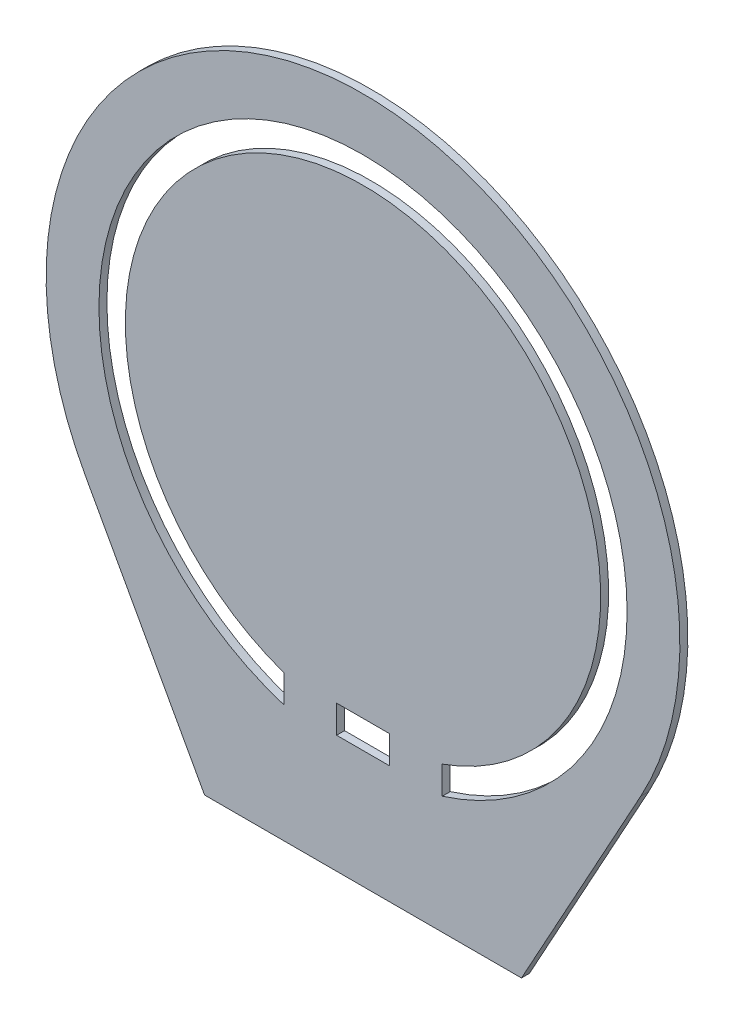
ISO-10303-21;
HEADER;
FILE_DESCRIPTION(('STEP AP214'),'2;1');
FILE_NAME('part.step','',(''),(''),'','','');
FILE_SCHEMA(('AUTOMOTIVE_DESIGN { 1 0 10303 214 1 1 1 1 }'));
ENDSEC;
DATA;
#1=APPLICATION_CONTEXT('core data for automotive mechanical design processes');
#2=APPLICATION_PROTOCOL_DEFINITION('international standard','automotive_design',2000,#1);
#3=PRODUCT_CONTEXT('',#1,'mechanical');
#4=PRODUCT('Part','Part','',(#3));
#5=PRODUCT_RELATED_PRODUCT_CATEGORY('part','',(#4));
#6=PRODUCT_DEFINITION_FORMATION('','',#4);
#7=PRODUCT_DEFINITION_CONTEXT('part definition',#1,'design');
#8=PRODUCT_DEFINITION('design','',#6,#7);
#9=PRODUCT_DEFINITION_SHAPE('','',#8);
#10=(LENGTH_UNIT() NAMED_UNIT(*) SI_UNIT(.MILLI.,.METRE.));
#11=(NAMED_UNIT(*) PLANE_ANGLE_UNIT() SI_UNIT($,.RADIAN.));
#12=(NAMED_UNIT(*) SI_UNIT($,.STERADIAN.) SOLID_ANGLE_UNIT());
#13=UNCERTAINTY_MEASURE_WITH_UNIT(LENGTH_MEASURE(1.E-05),#10,'distance_accuracy_value','');
#14=(GEOMETRIC_REPRESENTATION_CONTEXT(3) GLOBAL_UNCERTAINTY_ASSIGNED_CONTEXT((#13)) GLOBAL_UNIT_ASSIGNED_CONTEXT((#10,
#11,#12)) REPRESENTATION_CONTEXT('',''));
#15=CARTESIAN_POINT('',(0.,0.,0.));
#16=DIRECTION('',(0.,0.,1.));
#17=DIRECTION('',(1.,0.,0.));
#18=AXIS2_PLACEMENT_3D('',#15,#16,#17);
#19=CARTESIAN_POINT('',(26.2928846476365,-14.4459065795843,0.75438));
#20=DIRECTION('',(-0.876429488254552,0.481530219319478,0.));
#21=DIRECTION('',(-0.481530219319478,-0.876429488254552,0.));
#22=AXIS2_PLACEMENT_3D('',#19,#20,#21);
#23=PLANE('',#22);
#24=DIRECTION('',(0.481530219319478,0.876429488254552,0.));
#25=VECTOR('',#24,1.);
#26=CARTESIAN_POINT('',(26.2928846476365,-14.4459065795843,0.));
#27=LINE('',#26,#25);
#28=CARTESIAN_POINT('',(15.,-35.,0.));
#29=VERTEX_POINT('',#28);
#30=CARTESIAN_POINT('',(26.2928846476365,-14.4459065795843,0.));
#31=VERTEX_POINT('',#30);
#32=EDGE_CURVE('E179',#29,#31,#27,.T.);
#33=ORIENTED_EDGE('',*,*,#32,.T.);
#34=DIRECTION('',(0.,0.,-1.));
#35=VECTOR('',#34,1.);
#36=CARTESIAN_POINT('',(26.2928846476365,-14.4459065795843,0.75438));
#37=LINE('',#36,#35);
#38=CARTESIAN_POINT('',(26.2928846476365,-14.4459065795843,0.75438));
#39=VERTEX_POINT('',#38);
#40=EDGE_CURVE('E11',#39,#31,#37,.T.);
#41=ORIENTED_EDGE('',*,*,#40,.F.);
#42=DIRECTION('',(0.481530219319478,0.876429488254552,0.));
#43=VECTOR('',#42,1.);
#44=CARTESIAN_POINT('',(26.2928846476365,-14.4459065795843,0.75438));
#45=LINE('',#44,#43);
#46=CARTESIAN_POINT('',(15.,-35.,0.75438));
#47=VERTEX_POINT('',#46);
#48=EDGE_CURVE('E139',#47,#39,#45,.T.);
#49=ORIENTED_EDGE('',*,*,#48,.F.);
#50=DIRECTION('',(0.,0.,-1.));
#51=VECTOR('',#50,1.);
#52=CARTESIAN_POINT('',(15.,-35.,0.75438));
#53=LINE('',#52,#51);
#54=EDGE_CURVE('E187',#47,#29,#53,.T.);
#55=ORIENTED_EDGE('',*,*,#54,.T.);
#56=EDGE_LOOP('',(#33,#41,#49,#55));
#57=FACE_BOUND('',#56,.T.);
#58=ADVANCED_FACE('F38',(#57),#23,.F.);
#59=CARTESIAN_POINT('',(0.,0.,0.75438));
#60=DIRECTION('',(0.,0.,-1.));
#61=DIRECTION('',(-1.,0.,0.));
#62=AXIS2_PLACEMENT_3D('',#59,#60,#61);
#63=CYLINDRICAL_SURFACE('',#62,30.);
#64=CARTESIAN_POINT('',(0.,0.,0.));
#65=DIRECTION('',(0.,0.,1.));
#66=DIRECTION('',(1.,0.,0.));
#67=AXIS2_PLACEMENT_3D('',#64,#65,#66);
#68=CIRCLE('',#67,30.);
#69=CARTESIAN_POINT('',(-26.2928846476366,-14.4459065795843,0.));
#70=VERTEX_POINT('',#69);
#71=EDGE_CURVE('E145',#31,#70,#68,.T.);
#72=ORIENTED_EDGE('',*,*,#71,.T.);
#73=DIRECTION('',(0.,0.,-1.));
#74=VECTOR('',#73,1.);
#75=CARTESIAN_POINT('',(-26.2928846476366,-14.4459065795843,0.75438));
#76=LINE('',#75,#74);
#77=CARTESIAN_POINT('',(-26.2928846476366,-14.4459065795843,0.75438));
#78=VERTEX_POINT('',#77);
#79=EDGE_CURVE('E48',#78,#70,#76,.T.);
#80=ORIENTED_EDGE('',*,*,#79,.F.);
#81=CARTESIAN_POINT('',(0.,0.,0.75438));
#82=DIRECTION('',(0.,0.,1.));
#83=DIRECTION('',(1.,0.,0.));
#84=AXIS2_PLACEMENT_3D('',#81,#82,#83);
#85=CIRCLE('',#84,30.);
#86=EDGE_CURVE('E133',#39,#78,#85,.T.);
#87=ORIENTED_EDGE('',*,*,#86,.F.);
#88=ORIENTED_EDGE('',*,*,#40,.T.);
#89=EDGE_LOOP('',(#72,#80,#87,#88));
#90=FACE_BOUND('',#89,.T.);
#91=ADVANCED_FACE('F144',(#90),#63,.T.);
#92=CARTESIAN_POINT('',(-26.2928846476366,-14.4459065795843,0.75438));
#93=DIRECTION('',(-0.876429488254552,-0.481530219319478,0.));
#94=DIRECTION('',(0.481530219319478,-0.876429488254552,0.));
#95=AXIS2_PLACEMENT_3D('',#92,#93,#94);
#96=PLANE('',#95);
#97=DIRECTION('',(-0.481530219319478,0.876429488254552,0.));
#98=VECTOR('',#97,1.);
#99=CARTESIAN_POINT('',(-26.2928846476366,-14.4459065795843,0.));
#100=LINE('',#99,#98);
#101=CARTESIAN_POINT('',(-15.,-35.,0.));
#102=VERTEX_POINT('',#101);
#103=EDGE_CURVE('E183',#102,#70,#100,.T.);
#104=ORIENTED_EDGE('',*,*,#103,.F.);
#105=DIRECTION('',(0.,0.,-1.));
#106=VECTOR('',#105,1.);
#107=CARTESIAN_POINT('',(-15.,-35.,0.75438));
#108=LINE('',#107,#106);
#109=CARTESIAN_POINT('',(-15.,-35.,0.75438));
#110=VERTEX_POINT('',#109);
#111=EDGE_CURVE('E97',#110,#102,#108,.T.);
#112=ORIENTED_EDGE('',*,*,#111,.F.);
#113=DIRECTION('',(-0.481530219319478,0.876429488254552,0.));
#114=VECTOR('',#113,1.);
#115=CARTESIAN_POINT('',(-26.2928846476366,-14.4459065795843,0.75438));
#116=LINE('',#115,#114);
#117=EDGE_CURVE('E137',#110,#78,#116,.T.);
#118=ORIENTED_EDGE('',*,*,#117,.T.);
#119=ORIENTED_EDGE('',*,*,#79,.T.);
#120=EDGE_LOOP('',(#104,#112,#118,#119));
#121=FACE_BOUND('',#120,.T.);
#122=ADVANCED_FACE('F150',(#121),#96,.T.);
#123=CARTESIAN_POINT('',(2.5,0.,0.75438));
#124=DIRECTION('',(-1.,0.,0.));
#125=DIRECTION('',(0.,0.,1.));
#126=AXIS2_PLACEMENT_3D('',#123,#124,#125);
#127=PLANE('',#126);
#128=DIRECTION('',(0.,1.,0.));
#129=VECTOR('',#128,1.);
#130=CARTESIAN_POINT('',(2.5,0.,0.));
#131=LINE('',#130,#129);
#132=CARTESIAN_POINT('',(2.5,-23.8484800354236,0.));
#133=VERTEX_POINT('',#132);
#134=CARTESIAN_POINT('',(2.5,-21.2132034355964,0.));
#135=VERTEX_POINT('',#134);
#136=EDGE_CURVE('E167',#133,#135,#131,.T.);
#137=ORIENTED_EDGE('',*,*,#136,.F.);
#138=DIRECTION('',(0.,0.,-1.));
#139=VECTOR('',#138,1.);
#140=CARTESIAN_POINT('',(2.5,-23.8484800354236,0.75438));
#141=LINE('',#140,#139);
#142=CARTESIAN_POINT('',(2.5,-23.8484800354236,0.75438));
#143=VERTEX_POINT('',#142);
#144=EDGE_CURVE('E189',#143,#133,#141,.T.);
#145=ORIENTED_EDGE('',*,*,#144,.F.);
#146=DIRECTION('',(0.,1.,0.));
#147=VECTOR('',#146,1.);
#148=CARTESIAN_POINT('',(2.5,0.,0.75438));
#149=LINE('',#148,#147);
#150=CARTESIAN_POINT('',(2.5,-21.2132034355964,0.75438));
#151=VERTEX_POINT('',#150);
#152=EDGE_CURVE('E223',#143,#151,#149,.T.);
#153=ORIENTED_EDGE('',*,*,#152,.T.);
#154=DIRECTION('',(0.,0.,-1.));
#155=VECTOR('',#154,1.);
#156=CARTESIAN_POINT('',(2.5,-21.2132034355964,0.75438));
#157=LINE('',#156,#155);
#158=EDGE_CURVE('E191',#151,#135,#157,.T.);
#159=ORIENTED_EDGE('',*,*,#158,.T.);
#160=EDGE_LOOP('',(#137,#145,#153,#159));
#161=FACE_BOUND('',#160,.T.);
#162=ADVANCED_FACE('F254',(#161),#127,.T.);
#163=CARTESIAN_POINT('',(0.,-23.8484800354236,0.75438));
#164=DIRECTION('',(0.,1.,0.));
#165=DIRECTION('',(0.,0.,1.));
#166=AXIS2_PLACEMENT_3D('',#163,#164,#165);
#167=PLANE('',#166);
#168=DIRECTION('',(1.,0.,0.));
#169=VECTOR('',#168,1.);
#170=CARTESIAN_POINT('',(0.,-23.8484800354236,0.));
#171=LINE('',#170,#169);
#172=CARTESIAN_POINT('',(-2.5,-23.8484800354236,0.));
#173=VERTEX_POINT('',#172);
#174=EDGE_CURVE('E170',#173,#133,#171,.T.);
#175=ORIENTED_EDGE('',*,*,#174,.F.);
#176=DIRECTION('',(0.,0.,-1.));
#177=VECTOR('',#176,1.);
#178=CARTESIAN_POINT('',(-2.5,-23.8484800354236,0.75438));
#179=LINE('',#178,#177);
#180=CARTESIAN_POINT('',(-2.5,-23.8484800354236,0.75438));
#181=VERTEX_POINT('',#180);
#182=EDGE_CURVE('E195',#181,#173,#179,.T.);
#183=ORIENTED_EDGE('',*,*,#182,.F.);
#184=DIRECTION('',(1.,0.,0.));
#185=VECTOR('',#184,1.);
#186=CARTESIAN_POINT('',(0.,-23.8484800354236,0.75438));
#187=LINE('',#186,#185);
#188=EDGE_CURVE('E227',#181,#143,#187,.T.);
#189=ORIENTED_EDGE('',*,*,#188,.T.);
#190=ORIENTED_EDGE('',*,*,#144,.T.);
#191=EDGE_LOOP('',(#175,#183,#189,#190));
#192=FACE_BOUND('',#191,.T.);
#193=ADVANCED_FACE('F256',(#192),#167,.T.);
#194=CARTESIAN_POINT('',(-2.5,0.,0.75438));
#195=DIRECTION('',(-1.,0.,0.));
#196=DIRECTION('',(0.,0.,1.));
#197=AXIS2_PLACEMENT_3D('',#194,#195,#196);
#198=PLANE('',#197);
#199=DIRECTION('',(0.,1.,0.));
#200=VECTOR('',#199,1.);
#201=CARTESIAN_POINT('',(-2.5,0.,0.));
#202=LINE('',#201,#200);
#203=CARTESIAN_POINT('',(-2.5,-21.2132034355964,0.));
#204=VERTEX_POINT('',#203);
#205=EDGE_CURVE('E173',#173,#204,#202,.T.);
#206=ORIENTED_EDGE('',*,*,#205,.T.);
#207=DIRECTION('',(0.,0.,-1.));
#208=VECTOR('',#207,1.);
#209=CARTESIAN_POINT('',(-2.5,-21.2132034355964,0.75438));
#210=LINE('',#209,#208);
#211=CARTESIAN_POINT('',(-2.5,-21.2132034355964,0.75438));
#212=VERTEX_POINT('',#211);
#213=EDGE_CURVE('E193',#212,#204,#210,.T.);
#214=ORIENTED_EDGE('',*,*,#213,.F.);
#215=DIRECTION('',(0.,1.,0.));
#216=VECTOR('',#215,1.);
#217=CARTESIAN_POINT('',(-2.5,0.,0.75438));
#218=LINE('',#217,#216);
#219=EDGE_CURVE('E234',#181,#212,#218,.T.);
#220=ORIENTED_EDGE('',*,*,#219,.F.);
#221=ORIENTED_EDGE('',*,*,#182,.T.);
#222=EDGE_LOOP('',(#206,#214,#220,#221));
#223=FACE_BOUND('',#222,.T.);
#224=ADVANCED_FACE('F248',(#223),#198,.F.);
#225=CARTESIAN_POINT('',(-7.5,0.,0.75438));
#226=DIRECTION('',(-1.,0.,0.));
#227=DIRECTION('',(0.,0.,1.));
#228=AXIS2_PLACEMENT_3D('',#225,#226,#227);
#229=PLANE('',#228);
#230=DIRECTION('',(0.,1.,0.));
#231=VECTOR('',#230,1.);
#232=CARTESIAN_POINT('',(-7.5,0.,0.));
#233=LINE('',#232,#231);
#234=CARTESIAN_POINT('',(-7.5,-23.8484800354236,0.));
#235=VERTEX_POINT('',#234);
#236=CARTESIAN_POINT('',(-7.5,-21.2132034355964,0.));
#237=VERTEX_POINT('',#236);
#238=EDGE_CURVE('E156',#235,#237,#233,.T.);
#239=ORIENTED_EDGE('',*,*,#238,.F.);
#240=DIRECTION('',(0.,0.,-1.));
#241=VECTOR('',#240,1.);
#242=CARTESIAN_POINT('',(-7.5,-23.8484800354236,0.75438));
#243=LINE('',#242,#241);
#244=CARTESIAN_POINT('',(-7.5,-23.8484800354236,0.75438));
#245=VERTEX_POINT('',#244);
#246=EDGE_CURVE('E42',#245,#235,#243,.T.);
#247=ORIENTED_EDGE('',*,*,#246,.F.);
#248=DIRECTION('',(0.,1.,0.));
#249=VECTOR('',#248,1.);
#250=CARTESIAN_POINT('',(-7.5,0.,0.75438));
#251=LINE('',#250,#249);
#252=CARTESIAN_POINT('',(-7.5,-21.2132034355964,0.75438));
#253=VERTEX_POINT('',#252);
#254=EDGE_CURVE('E186',#245,#253,#251,.T.);
#255=ORIENTED_EDGE('',*,*,#254,.T.);
#256=DIRECTION('',(0.,0.,-1.));
#257=VECTOR('',#256,1.);
#258=CARTESIAN_POINT('',(-7.5,-21.2132034355964,0.75438));
#259=LINE('',#258,#257);
#260=EDGE_CURVE('E152',#253,#237,#259,.T.);
#261=ORIENTED_EDGE('',*,*,#260,.T.);
#262=EDGE_LOOP('',(#239,#247,#255,#261));
#263=FACE_BOUND('',#262,.T.);
#264=ADVANCED_FACE('F40',(#263),#229,.T.);
#265=CARTESIAN_POINT('',(0.,0.,0.75438));
#266=DIRECTION('',(0.,0.,-1.));
#267=DIRECTION('',(-1.,0.,0.));
#268=AXIS2_PLACEMENT_3D('',#265,#266,#267);
#269=CYLINDRICAL_SURFACE('',#268,25.);
#270=CARTESIAN_POINT('',(0.,0.,0.));
#271=DIRECTION('',(0.,0.,1.));
#272=DIRECTION('',(1.,0.,0.));
#273=AXIS2_PLACEMENT_3D('',#270,#271,#272);
#274=CIRCLE('',#273,25.);
#275=CARTESIAN_POINT('',(7.5,-23.8484800354236,0.));
#276=VERTEX_POINT('',#275);
#277=EDGE_CURVE('E159',#276,#235,#274,.T.);
#278=ORIENTED_EDGE('',*,*,#277,.F.);
#279=DIRECTION('',(0.,0.,-1.));
#280=VECTOR('',#279,1.);
#281=CARTESIAN_POINT('',(7.5,-23.8484800354236,0.75438));
#282=LINE('',#281,#280);
#283=CARTESIAN_POINT('',(7.5,-23.8484800354236,0.75438));
#284=VERTEX_POINT('',#283);
#285=EDGE_CURVE('E201',#284,#276,#282,.T.);
#286=ORIENTED_EDGE('',*,*,#285,.F.);
#287=CARTESIAN_POINT('',(0.,0.,0.75438));
#288=DIRECTION('',(0.,0.,1.));
#289=DIRECTION('',(1.,0.,0.));
#290=AXIS2_PLACEMENT_3D('',#287,#288,#289);
#291=CIRCLE('',#290,25.);
#292=EDGE_CURVE('E210',#284,#245,#291,.T.);
#293=ORIENTED_EDGE('',*,*,#292,.T.);
#294=ORIENTED_EDGE('',*,*,#246,.T.);
#295=EDGE_LOOP('',(#278,#286,#293,#294));
#296=FACE_BOUND('',#295,.T.);
#297=ADVANCED_FACE('F208',(#296),#269,.F.);
#298=CARTESIAN_POINT('',(7.5,0.,0.75438));
#299=DIRECTION('',(-1.,0.,0.));
#300=DIRECTION('',(0.,0.,1.));
#301=AXIS2_PLACEMENT_3D('',#298,#299,#300);
#302=PLANE('',#301);
#303=DIRECTION('',(0.,1.,0.));
#304=VECTOR('',#303,1.);
#305=CARTESIAN_POINT('',(7.5,0.,0.));
#306=LINE('',#305,#304);
#307=CARTESIAN_POINT('',(7.5,-21.2132034355964,0.));
#308=VERTEX_POINT('',#307);
#309=EDGE_CURVE('E162',#276,#308,#306,.T.);
#310=ORIENTED_EDGE('',*,*,#309,.T.);
#311=DIRECTION('',(0.,0.,-1.));
#312=VECTOR('',#311,1.);
#313=CARTESIAN_POINT('',(7.5,-21.2132034355964,0.75438));
#314=LINE('',#313,#312);
#315=CARTESIAN_POINT('',(7.5,-21.2132034355964,0.75438));
#316=VERTEX_POINT('',#315);
#317=EDGE_CURVE('E199',#316,#308,#314,.T.);
#318=ORIENTED_EDGE('',*,*,#317,.F.);
#319=DIRECTION('',(0.,1.,0.));
#320=VECTOR('',#319,1.);
#321=CARTESIAN_POINT('',(7.5,0.,0.75438));
#322=LINE('',#321,#320);
#323=EDGE_CURVE('E224',#284,#316,#322,.T.);
#324=ORIENTED_EDGE('',*,*,#323,.F.);
#325=ORIENTED_EDGE('',*,*,#285,.T.);
#326=EDGE_LOOP('',(#310,#318,#324,#325));
#327=FACE_BOUND('',#326,.T.);
#328=ADVANCED_FACE('F217',(#327),#302,.F.);
#329=CARTESIAN_POINT('',(0.,-21.2132034355964,0.75438));
#330=DIRECTION('',(0.,-1.,0.));
#331=DIRECTION('',(0.,0.,-1.));
#332=AXIS2_PLACEMENT_3D('',#329,#330,#331);
#333=PLANE('',#332);
#334=DIRECTION('',(-1.,0.,0.));
#335=VECTOR('',#334,1.);
#336=CARTESIAN_POINT('',(0.,-21.2132034355964,0.));
#337=LINE('',#336,#335);
#338=EDGE_CURVE('E176',#135,#204,#337,.T.);
#339=ORIENTED_EDGE('',*,*,#338,.F.);
#340=ORIENTED_EDGE('',*,*,#158,.F.);
#341=DIRECTION('',(-1.,0.,0.));
#342=VECTOR('',#341,1.);
#343=CARTESIAN_POINT('',(0.,-21.2132034355964,0.75438));
#344=LINE('',#343,#342);
#345=EDGE_CURVE('E236',#151,#212,#344,.T.);
#346=ORIENTED_EDGE('',*,*,#345,.T.);
#347=ORIENTED_EDGE('',*,*,#213,.T.);
#348=EDGE_LOOP('',(#339,#340,#346,#347));
#349=FACE_BOUND('',#348,.T.);
#350=ADVANCED_FACE('F241',(#349),#333,.T.);
#351=CARTESIAN_POINT('',(0.,0.,0.75438));
#352=DIRECTION('',(0.,0.,-1.));
#353=DIRECTION('',(-1.,0.,0.));
#354=AXIS2_PLACEMENT_3D('',#351,#352,#353);
#355=CYLINDRICAL_SURFACE('',#354,22.5);
#356=CARTESIAN_POINT('',(0.,0.,0.));
#357=DIRECTION('',(0.,0.,1.));
#358=DIRECTION('',(1.,0.,0.));
#359=AXIS2_PLACEMENT_3D('',#356,#357,#358);
#360=CIRCLE('',#359,22.5);
#361=EDGE_CURVE('E164',#308,#237,#360,.T.);
#362=ORIENTED_EDGE('',*,*,#361,.T.);
#363=ORIENTED_EDGE('',*,*,#260,.F.);
#364=CARTESIAN_POINT('',(0.,0.,0.75438));
#365=DIRECTION('',(0.,0.,1.));
#366=DIRECTION('',(1.,0.,0.));
#367=AXIS2_PLACEMENT_3D('',#364,#365,#366);
#368=CIRCLE('',#367,22.5);
#369=EDGE_CURVE('E221',#316,#253,#368,.T.);
#370=ORIENTED_EDGE('',*,*,#369,.F.);
#371=ORIENTED_EDGE('',*,*,#317,.T.);
#372=EDGE_LOOP('',(#362,#363,#370,#371));
#373=FACE_BOUND('',#372,.T.);
#374=ADVANCED_FACE('F220',(#373),#355,.T.);
#375=CARTESIAN_POINT('',(0.,-35.,0.75438));
#376=DIRECTION('',(0.,1.,0.));
#377=DIRECTION('',(0.,0.,1.));
#378=AXIS2_PLACEMENT_3D('',#375,#376,#377);
#379=PLANE('',#378);
#380=DIRECTION('',(1.,0.,0.));
#381=VECTOR('',#380,1.);
#382=CARTESIAN_POINT('',(0.,-35.,0.));
#383=LINE('',#382,#381);
#384=EDGE_CURVE('E100',#102,#29,#383,.T.);
#385=ORIENTED_EDGE('',*,*,#384,.T.);
#386=ORIENTED_EDGE('',*,*,#54,.F.);
#387=DIRECTION('',(1.,0.,0.));
#388=VECTOR('',#387,1.);
#389=CARTESIAN_POINT('',(0.,-35.,0.75438));
#390=LINE('',#389,#388);
#391=EDGE_CURVE('E57',#110,#47,#390,.T.);
#392=ORIENTED_EDGE('',*,*,#391,.F.);
#393=ORIENTED_EDGE('',*,*,#111,.T.);
#394=EDGE_LOOP('',(#385,#386,#392,#393));
#395=FACE_BOUND('',#394,.T.);
#396=ADVANCED_FACE('F279',(#395),#379,.F.);
#397=CARTESIAN_POINT('',(0.,0.,0.75438));
#398=DIRECTION('',(0.,0.,1.));
#399=DIRECTION('',(1.,0.,0.));
#400=AXIS2_PLACEMENT_3D('',#397,#398,#399);
#401=PLANE('',#400);
#402=ORIENTED_EDGE('',*,*,#254,.F.);
#403=ORIENTED_EDGE('',*,*,#292,.F.);
#404=ORIENTED_EDGE('',*,*,#323,.T.);
#405=ORIENTED_EDGE('',*,*,#369,.T.);
#406=EDGE_LOOP('',(#402,#403,#404,#405));
#407=FACE_BOUND('',#406,.T.);
#408=ORIENTED_EDGE('',*,*,#152,.F.);
#409=ORIENTED_EDGE('',*,*,#188,.F.);
#410=ORIENTED_EDGE('',*,*,#219,.T.);
#411=ORIENTED_EDGE('',*,*,#345,.F.);
#412=EDGE_LOOP('',(#408,#409,#410,#411));
#413=FACE_BOUND('',#412,.T.);
#414=ORIENTED_EDGE('',*,*,#48,.T.);
#415=ORIENTED_EDGE('',*,*,#86,.T.);
#416=ORIENTED_EDGE('',*,*,#117,.F.);
#417=ORIENTED_EDGE('',*,*,#391,.T.);
#418=EDGE_LOOP('',(#414,#415,#416,#417));
#419=FACE_BOUND('',#418,.T.);
#420=ADVANCED_FACE('F135',(#407,#413,#419),#401,.T.);
#421=CARTESIAN_POINT('',(0.,0.,0.));
#422=DIRECTION('',(0.,0.,1.));
#423=DIRECTION('',(1.,0.,0.));
#424=AXIS2_PLACEMENT_3D('',#421,#422,#423);
#425=PLANE('',#424);
#426=ORIENTED_EDGE('',*,*,#238,.T.);
#427=ORIENTED_EDGE('',*,*,#361,.F.);
#428=ORIENTED_EDGE('',*,*,#309,.F.);
#429=ORIENTED_EDGE('',*,*,#277,.T.);
#430=EDGE_LOOP('',(#426,#427,#428,#429));
#431=FACE_BOUND('',#430,.T.);
#432=ORIENTED_EDGE('',*,*,#136,.T.);
#433=ORIENTED_EDGE('',*,*,#338,.T.);
#434=ORIENTED_EDGE('',*,*,#205,.F.);
#435=ORIENTED_EDGE('',*,*,#174,.T.);
#436=EDGE_LOOP('',(#432,#433,#434,#435));
#437=FACE_BOUND('',#436,.T.);
#438=ORIENTED_EDGE('',*,*,#32,.F.);
#439=ORIENTED_EDGE('',*,*,#384,.F.);
#440=ORIENTED_EDGE('',*,*,#103,.T.);
#441=ORIENTED_EDGE('',*,*,#71,.F.);
#442=EDGE_LOOP('',(#438,#439,#440,#441));
#443=FACE_BOUND('',#442,.T.);
#444=ADVANCED_FACE('F214',(#431,#437,#443),#425,.F.);
#445=CLOSED_SHELL('',(#58,#91,#122,#162,#193,#224,#264,#297,#328,#350,#374,#396,#420,#444));
#446=MANIFOLD_SOLID_BREP('B2',#445);
#447=ADVANCED_BREP_SHAPE_REPRESENTATION('',(#18,#446),#14);
#448=SHAPE_DEFINITION_REPRESENTATION(#9,#447);
ENDSEC;
END-ISO-10303-21;
